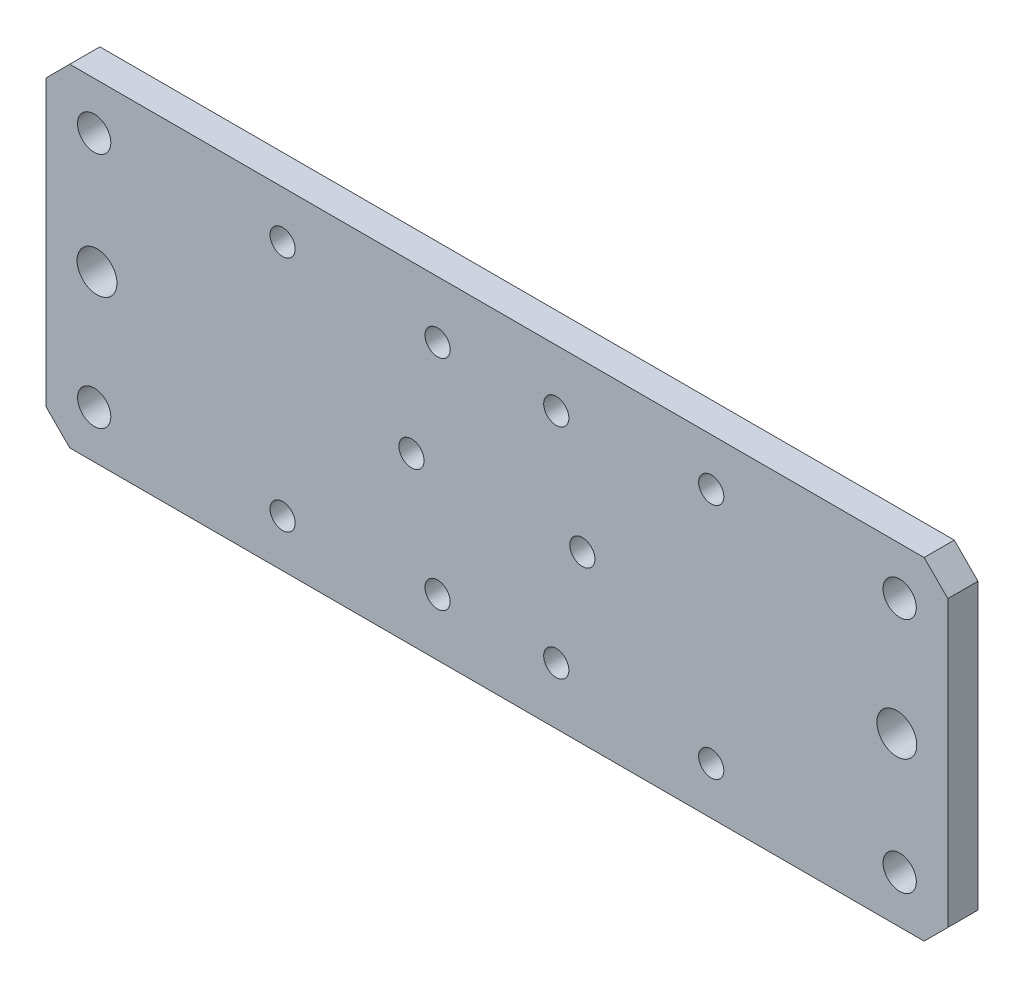
ISO-10303-21;
HEADER;
FILE_DESCRIPTION(('STEP AP214'),'2;1');
FILE_NAME('part.step','',(''),(''),'','','');
FILE_SCHEMA(('AUTOMOTIVE_DESIGN { 1 0 10303 214 1 1 1 1 }'));
ENDSEC;
DATA;
#1=APPLICATION_CONTEXT('core data for automotive mechanical design processes');
#2=APPLICATION_PROTOCOL_DEFINITION('international standard','automotive_design',2000,#1);
#3=PRODUCT_CONTEXT('',#1,'mechanical');
#4=PRODUCT('Part','Part','',(#3));
#5=PRODUCT_RELATED_PRODUCT_CATEGORY('part','',(#4));
#6=PRODUCT_DEFINITION_FORMATION('','',#4);
#7=PRODUCT_DEFINITION_CONTEXT('part definition',#1,'design');
#8=PRODUCT_DEFINITION('design','',#6,#7);
#9=PRODUCT_DEFINITION_SHAPE('','',#8);
#10=(LENGTH_UNIT() NAMED_UNIT(*) SI_UNIT(.MILLI.,.METRE.));
#11=(NAMED_UNIT(*) PLANE_ANGLE_UNIT() SI_UNIT($,.RADIAN.));
#12=(NAMED_UNIT(*) SI_UNIT($,.STERADIAN.) SOLID_ANGLE_UNIT());
#13=UNCERTAINTY_MEASURE_WITH_UNIT(LENGTH_MEASURE(1.E-05),#10,'distance_accuracy_value','');
#14=(GEOMETRIC_REPRESENTATION_CONTEXT(3) GLOBAL_UNCERTAINTY_ASSIGNED_CONTEXT((#13)) GLOBAL_UNIT_ASSIGNED_CONTEXT((#10,
#11,#12)) REPRESENTATION_CONTEXT('',''));
#15=CARTESIAN_POINT('',(0.,0.,0.));
#16=DIRECTION('',(0.,0.,1.));
#17=DIRECTION('',(1.,0.,0.));
#18=AXIS2_PLACEMENT_3D('',#15,#16,#17);
#19=CARTESIAN_POINT('',(0.,0.,17.4999999999999));
#20=DIRECTION('',(0.,0.,1.));
#21=DIRECTION('',(1.,0.,0.));
#22=AXIS2_PLACEMENT_3D('',#19,#20,#21);
#23=PLANE('',#22);
#24=CARTESIAN_POINT('',(-12.5,23.,17.4999999999999));
#25=DIRECTION('',(0.,0.,1.));
#26=DIRECTION('',(1.,0.,0.));
#27=AXIS2_PLACEMENT_3D('',#24,#25,#26);
#28=CIRCLE('',#27,2.65);
#29=CARTESIAN_POINT('',(-9.85,23.,17.4999999999999));
#30=VERTEX_POINT('',#29);
#31=EDGE_CURVE('E262',#30,#30,#28,.T.);
#32=ORIENTED_EDGE('',*,*,#31,.F.);
#33=EDGE_LOOP('',(#32));
#34=FACE_BOUND('',#33,.T.);
#35=CARTESIAN_POINT('',(12.5,23.,17.4999999999999));
#36=DIRECTION('',(0.,0.,1.));
#37=DIRECTION('',(1.,0.,0.));
#38=AXIS2_PLACEMENT_3D('',#35,#36,#37);
#39=CIRCLE('',#38,2.65);
#40=CARTESIAN_POINT('',(15.15,23.,17.4999999999999));
#41=VERTEX_POINT('',#40);
#42=EDGE_CURVE('E256',#41,#41,#39,.T.);
#43=ORIENTED_EDGE('',*,*,#42,.F.);
#44=EDGE_LOOP('',(#43));
#45=FACE_BOUND('',#44,.T.);
#46=CARTESIAN_POINT('',(18.,0.,17.4999999999999));
#47=DIRECTION('',(0.,0.,1.));
#48=DIRECTION('',(1.,0.,0.));
#49=AXIS2_PLACEMENT_3D('',#46,#47,#48);
#50=CIRCLE('',#49,2.65);
#51=CARTESIAN_POINT('',(20.65,0.,17.4999999999999));
#52=VERTEX_POINT('',#51);
#53=EDGE_CURVE('E250',#52,#52,#50,.T.);
#54=ORIENTED_EDGE('',*,*,#53,.F.);
#55=EDGE_LOOP('',(#54));
#56=FACE_BOUND('',#55,.T.);
#57=CARTESIAN_POINT('',(12.5,-23.,17.4999999999999));
#58=DIRECTION('',(0.,0.,1.));
#59=DIRECTION('',(1.,0.,0.));
#60=AXIS2_PLACEMENT_3D('',#57,#58,#59);
#61=CIRCLE('',#60,2.65);
#62=CARTESIAN_POINT('',(15.15,-23.,17.4999999999999));
#63=VERTEX_POINT('',#62);
#64=EDGE_CURVE('E244',#63,#63,#61,.T.);
#65=ORIENTED_EDGE('',*,*,#64,.F.);
#66=EDGE_LOOP('',(#65));
#67=FACE_BOUND('',#66,.T.);
#68=CARTESIAN_POINT('',(-12.5,-23.,17.4999999999999));
#69=DIRECTION('',(0.,0.,1.));
#70=DIRECTION('',(1.,0.,0.));
#71=AXIS2_PLACEMENT_3D('',#68,#69,#70);
#72=CIRCLE('',#71,2.65);
#73=CARTESIAN_POINT('',(-9.85,-23.,17.4999999999999));
#74=VERTEX_POINT('',#73);
#75=EDGE_CURVE('E238',#74,#74,#72,.T.);
#76=ORIENTED_EDGE('',*,*,#75,.F.);
#77=EDGE_LOOP('',(#76));
#78=FACE_BOUND('',#77,.T.);
#79=CARTESIAN_POINT('',(-18.,0.,17.4999999999999));
#80=DIRECTION('',(0.,0.,1.));
#81=DIRECTION('',(1.,0.,0.));
#82=AXIS2_PLACEMENT_3D('',#79,#80,#81);
#83=CIRCLE('',#82,2.65);
#84=CARTESIAN_POINT('',(-15.35,0.,17.4999999999999));
#85=VERTEX_POINT('',#84);
#86=EDGE_CURVE('E232',#85,#85,#83,.T.);
#87=ORIENTED_EDGE('',*,*,#86,.F.);
#88=EDGE_LOOP('',(#87));
#89=FACE_BOUND('',#88,.T.);
#90=CARTESIAN_POINT('',(84.8500000000001,-25.,17.4999999999999));
#91=DIRECTION('',(0.,0.,-1.));
#92=DIRECTION('',(-1.,0.,0.));
#93=AXIS2_PLACEMENT_3D('',#90,#91,#92);
#94=CIRCLE('',#93,3.5);
#95=CARTESIAN_POINT('',(81.3500000000001,-25.,17.4999999999999));
#96=VERTEX_POINT('',#95);
#97=EDGE_CURVE('E189',#96,#96,#94,.T.);
#98=ORIENTED_EDGE('',*,*,#97,.T.);
#99=EDGE_LOOP('',(#98));
#100=FACE_BOUND('',#99,.T.);
#101=CARTESIAN_POINT('',(-84.8500000000001,25.,17.4999999999999));
#102=DIRECTION('',(0.,0.,-1.));
#103=DIRECTION('',(-1.,0.,0.));
#104=AXIS2_PLACEMENT_3D('',#101,#102,#103);
#105=CIRCLE('',#104,3.5);
#106=CARTESIAN_POINT('',(-88.3500000000001,25.,17.4999999999999));
#107=VERTEX_POINT('',#106);
#108=EDGE_CURVE('E186',#107,#107,#105,.T.);
#109=ORIENTED_EDGE('',*,*,#108,.T.);
#110=EDGE_LOOP('',(#109));
#111=FACE_BOUND('',#110,.T.);
#112=CARTESIAN_POINT('',(-84.8500000000001,-25.,17.4999999999999));
#113=DIRECTION('',(0.,0.,-1.));
#114=DIRECTION('',(-1.,0.,0.));
#115=AXIS2_PLACEMENT_3D('',#112,#113,#114);
#116=CIRCLE('',#115,3.5);
#117=CARTESIAN_POINT('',(-88.3500000000001,-25.,17.4999999999999));
#118=VERTEX_POINT('',#117);
#119=EDGE_CURVE('E183',#118,#118,#116,.T.);
#120=ORIENTED_EDGE('',*,*,#119,.T.);
#121=EDGE_LOOP('',(#120));
#122=FACE_BOUND('',#121,.T.);
#123=CARTESIAN_POINT('',(84.8500000000001,25.,17.4999999999999));
#124=DIRECTION('',(0.,0.,-1.));
#125=DIRECTION('',(-1.,0.,0.));
#126=AXIS2_PLACEMENT_3D('',#123,#124,#125);
#127=CIRCLE('',#126,3.5);
#128=CARTESIAN_POINT('',(81.3500000000001,25.,17.4999999999999));
#129=VERTEX_POINT('',#128);
#130=EDGE_CURVE('E180',#129,#129,#127,.T.);
#131=ORIENTED_EDGE('',*,*,#130,.T.);
#132=EDGE_LOOP('',(#131));
#133=FACE_BOUND('',#132,.T.);
#134=CARTESIAN_POINT('',(84.25,0.,17.4999999999999));
#135=DIRECTION('',(0.,0.,-1.));
#136=DIRECTION('',(-1.,0.,0.));
#137=AXIS2_PLACEMENT_3D('',#134,#135,#136);
#138=CIRCLE('',#137,4.2);
#139=CARTESIAN_POINT('',(80.05,0.,17.4999999999999));
#140=VERTEX_POINT('',#139);
#141=EDGE_CURVE('E177',#140,#140,#138,.T.);
#142=ORIENTED_EDGE('',*,*,#141,.T.);
#143=EDGE_LOOP('',(#142));
#144=FACE_BOUND('',#143,.T.);
#145=CARTESIAN_POINT('',(-84.25,0.,17.4999999999999));
#146=DIRECTION('',(0.,0.,-1.));
#147=DIRECTION('',(-1.,0.,0.));
#148=AXIS2_PLACEMENT_3D('',#145,#146,#147);
#149=CIRCLE('',#148,4.2);
#150=CARTESIAN_POINT('',(-88.45,0.,17.4999999999999));
#151=VERTEX_POINT('',#150);
#152=EDGE_CURVE('E174',#151,#151,#149,.T.);
#153=ORIENTED_EDGE('',*,*,#152,.T.);
#154=EDGE_LOOP('',(#153));
#155=FACE_BOUND('',#154,.T.);
#156=CARTESIAN_POINT('',(45.1500000000001,-25.0000000000001,17.4999999999999));
#157=DIRECTION('',(0.,0.,-1.));
#158=DIRECTION('',(-1.,0.,0.));
#159=AXIS2_PLACEMENT_3D('',#156,#157,#158);
#160=CIRCLE('',#159,2.65);
#161=CARTESIAN_POINT('',(42.5000000000001,-25.0000000000001,17.4999999999999));
#162=VERTEX_POINT('',#161);
#163=EDGE_CURVE('E171',#162,#162,#160,.T.);
#164=ORIENTED_EDGE('',*,*,#163,.T.);
#165=EDGE_LOOP('',(#164));
#166=FACE_BOUND('',#165,.T.);
#167=CARTESIAN_POINT('',(-45.15,25.,17.4999999999999));
#168=DIRECTION('',(0.,0.,-1.));
#169=DIRECTION('',(-1.,0.,0.));
#170=AXIS2_PLACEMENT_3D('',#167,#168,#169);
#171=CIRCLE('',#170,2.65);
#172=CARTESIAN_POINT('',(-47.8,25.,17.4999999999999));
#173=VERTEX_POINT('',#172);
#174=EDGE_CURVE('E168',#173,#173,#171,.T.);
#175=ORIENTED_EDGE('',*,*,#174,.T.);
#176=EDGE_LOOP('',(#175));
#177=FACE_BOUND('',#176,.T.);
#178=CARTESIAN_POINT('',(-45.1500000000001,-25.0000000000001,17.4999999999999));
#179=DIRECTION('',(0.,0.,-1.));
#180=DIRECTION('',(-1.,0.,0.));
#181=AXIS2_PLACEMENT_3D('',#178,#179,#180);
#182=CIRCLE('',#181,2.65);
#183=CARTESIAN_POINT('',(-47.8000000000001,-25.0000000000001,17.4999999999999));
#184=VERTEX_POINT('',#183);
#185=EDGE_CURVE('E165',#184,#184,#182,.T.);
#186=ORIENTED_EDGE('',*,*,#185,.T.);
#187=EDGE_LOOP('',(#186));
#188=FACE_BOUND('',#187,.T.);
#189=CARTESIAN_POINT('',(45.15,25.,17.4999999999999));
#190=DIRECTION('',(0.,0.,-1.));
#191=DIRECTION('',(-1.,0.,0.));
#192=AXIS2_PLACEMENT_3D('',#189,#190,#191);
#193=CIRCLE('',#192,2.65);
#194=CARTESIAN_POINT('',(42.5,25.,17.4999999999999));
#195=VERTEX_POINT('',#194);
#196=EDGE_CURVE('E162',#195,#195,#193,.T.);
#197=ORIENTED_EDGE('',*,*,#196,.T.);
#198=EDGE_LOOP('',(#197));
#199=FACE_BOUND('',#198,.T.);
#200=DIRECTION('',(1.,0.,0.));
#201=VECTOR('',#200,1.);
#202=CARTESIAN_POINT('',(95.,34.9999999999998,17.4999999999999));
#203=LINE('',#202,#201);
#204=CARTESIAN_POINT('',(-90.,34.9999999999998,17.4999999999999));
#205=VERTEX_POINT('',#204);
#206=CARTESIAN_POINT('',(90.,34.9999999999998,17.4999999999999));
#207=VERTEX_POINT('',#206);
#208=EDGE_CURVE('E144',#205,#207,#203,.T.);
#209=ORIENTED_EDGE('',*,*,#208,.F.);
#210=DIRECTION('',(0.70710678118655,0.707106781186545,0.));
#211=VECTOR('',#210,1.);
#212=CARTESIAN_POINT('',(-62.4999999999996,62.5,17.4999999999999));
#213=LINE('',#212,#211);
#214=CARTESIAN_POINT('',(-95.,29.9999999999998,17.4999999999999));
#215=VERTEX_POINT('',#214);
#216=EDGE_CURVE('E114',#205,#215,#213,.F.);
#217=ORIENTED_EDGE('',*,*,#216,.T.);
#218=DIRECTION('',(0.,-1.,0.));
#219=VECTOR('',#218,1.);
#220=CARTESIAN_POINT('',(-95.,34.9999999999998,17.4999999999999));
#221=LINE('',#220,#219);
#222=CARTESIAN_POINT('',(-94.9999999999999,-29.9999999999997,17.4999999999999));
#223=VERTEX_POINT('',#222);
#224=EDGE_CURVE('E104',#223,#215,#221,.F.);
#225=ORIENTED_EDGE('',*,*,#224,.F.);
#226=DIRECTION('',(-0.707106781186546,0.707106781186549,0.));
#227=VECTOR('',#226,1.);
#228=CARTESIAN_POINT('',(-62.5000000000001,-62.4999999999998,17.4999999999999));
#229=LINE('',#228,#227);
#230=CARTESIAN_POINT('',(-89.9999999999999,-34.9999999999998,17.4999999999999));
#231=VERTEX_POINT('',#230);
#232=EDGE_CURVE('E48',#223,#231,#229,.F.);
#233=ORIENTED_EDGE('',*,*,#232,.T.);
#234=DIRECTION('',(1.,0.,0.));
#235=VECTOR('',#234,1.);
#236=CARTESIAN_POINT('',(-94.9999999999999,-34.9999999999998,17.4999999999999));
#237=LINE('',#236,#235);
#238=CARTESIAN_POINT('',(90.,-34.9999999999999,17.4999999999999));
#239=VERTEX_POINT('',#238);
#240=EDGE_CURVE('E115',#239,#231,#237,.F.);
#241=ORIENTED_EDGE('',*,*,#240,.F.);
#242=DIRECTION('',(-0.707106781186548,-0.707106781186547,0.));
#243=VECTOR('',#242,1.);
#244=CARTESIAN_POINT('',(62.4999999999998,-62.4999999999999,17.4999999999999));
#245=LINE('',#244,#243);
#246=CARTESIAN_POINT('',(95.,-29.9999999999999,17.4999999999999));
#247=VERTEX_POINT('',#246);
#248=EDGE_CURVE('E122',#239,#247,#245,.F.);
#249=ORIENTED_EDGE('',*,*,#248,.T.);
#250=DIRECTION('',(0.,1.,0.));
#251=VECTOR('',#250,1.);
#252=CARTESIAN_POINT('',(95.,-34.9999999999998,17.4999999999999));
#253=LINE('',#252,#251);
#254=CARTESIAN_POINT('',(95.,29.9999999999998,17.4999999999999));
#255=VERTEX_POINT('',#254);
#256=EDGE_CURVE('E136',#255,#247,#253,.F.);
#257=ORIENTED_EDGE('',*,*,#256,.F.);
#258=DIRECTION('',(0.707106781186546,-0.707106781186549,0.));
#259=VECTOR('',#258,1.);
#260=CARTESIAN_POINT('',(62.5000000000002,62.4999999999998,17.4999999999999));
#261=LINE('',#260,#259);
#262=EDGE_CURVE('E125',#255,#207,#261,.F.);
#263=ORIENTED_EDGE('',*,*,#262,.T.);
#264=EDGE_LOOP('',(#209,#217,#225,#233,#241,#249,#257,#263));
#265=FACE_BOUND('',#264,.T.);
#266=ADVANCED_FACE('F33',(#34,#45,#56,#67,#78,#89,#100,#111,#122,#133,#144,#155,#166,#177,#188,
#199,#265),#23,.T.);
#267=CARTESIAN_POINT('',(-95.,34.9999999999998,11.1499999999999));
#268=DIRECTION('',(-1.,0.,0.));
#269=DIRECTION('',(0.,-1.,0.));
#270=AXIS2_PLACEMENT_3D('',#267,#268,#269);
#271=PLANE('',#270);
#272=ORIENTED_EDGE('',*,*,#224,.T.);
#273=DIRECTION('',(0.,0.,-1.));
#274=VECTOR('',#273,1.);
#275=CARTESIAN_POINT('',(-95.,29.9999999999998,11.1499999999999));
#276=LINE('',#275,#274);
#277=CARTESIAN_POINT('',(-95.,29.9999999999998,11.1499999999999));
#278=VERTEX_POINT('',#277);
#279=EDGE_CURVE('E109',#215,#278,#276,.T.);
#280=ORIENTED_EDGE('',*,*,#279,.T.);
#281=DIRECTION('',(0.,1.,0.));
#282=VECTOR('',#281,1.);
#283=CARTESIAN_POINT('',(-95.,0.,11.1499999999999));
#284=LINE('',#283,#282);
#285=CARTESIAN_POINT('',(-95.,-29.9999999999997,11.1499999999999));
#286=VERTEX_POINT('',#285);
#287=EDGE_CURVE('E107',#278,#286,#284,.F.);
#288=ORIENTED_EDGE('',*,*,#287,.T.);
#289=DIRECTION('',(0.,0.,1.));
#290=VECTOR('',#289,1.);
#291=CARTESIAN_POINT('',(-94.9999999999999,-29.9999999999997,11.1499999999999));
#292=LINE('',#291,#290);
#293=EDGE_CURVE('E101',#286,#223,#292,.T.);
#294=ORIENTED_EDGE('',*,*,#293,.T.);
#295=EDGE_LOOP('',(#272,#280,#288,#294));
#296=FACE_BOUND('',#295,.T.);
#297=ADVANCED_FACE('F102',(#296),#271,.T.);
#298=CARTESIAN_POINT('',(-94.9999999999999,-34.9999999999998,11.1499999999999));
#299=DIRECTION('',(0.,-1.,0.));
#300=DIRECTION('',(1.,0.,0.));
#301=AXIS2_PLACEMENT_3D('',#298,#299,#300);
#302=PLANE('',#301);
#303=ORIENTED_EDGE('',*,*,#240,.T.);
#304=DIRECTION('',(0.,0.,-1.));
#305=VECTOR('',#304,1.);
#306=CARTESIAN_POINT('',(-89.9999999999999,-34.9999999999998,11.1499999999999));
#307=LINE('',#306,#305);
#308=CARTESIAN_POINT('',(-89.9999999999999,-34.9999999999998,11.1499999999999));
#309=VERTEX_POINT('',#308);
#310=EDGE_CURVE('E121',#231,#309,#307,.T.);
#311=ORIENTED_EDGE('',*,*,#310,.T.);
#312=DIRECTION('',(1.,0.,0.));
#313=VECTOR('',#312,1.);
#314=CARTESIAN_POINT('',(0.,-34.9999999999998,11.1499999999999));
#315=LINE('',#314,#313);
#316=CARTESIAN_POINT('',(90.,-34.9999999999998,11.1499999999999));
#317=VERTEX_POINT('',#316);
#318=EDGE_CURVE('E225',#309,#317,#315,.T.);
#319=ORIENTED_EDGE('',*,*,#318,.T.);
#320=DIRECTION('',(0.,0.,1.));
#321=VECTOR('',#320,1.);
#322=CARTESIAN_POINT('',(90.,-34.9999999999999,11.1499999999999));
#323=LINE('',#322,#321);
#324=EDGE_CURVE('E55',#317,#239,#323,.T.);
#325=ORIENTED_EDGE('',*,*,#324,.T.);
#326=EDGE_LOOP('',(#303,#311,#319,#325));
#327=FACE_BOUND('',#326,.T.);
#328=ADVANCED_FACE('F377',(#327),#302,.T.);
#329=CARTESIAN_POINT('',(95.,-34.9999999999998,11.1499999999999));
#330=DIRECTION('',(1.,0.,0.));
#331=DIRECTION('',(0.,1.,0.));
#332=AXIS2_PLACEMENT_3D('',#329,#330,#331);
#333=PLANE('',#332);
#334=ORIENTED_EDGE('',*,*,#256,.T.);
#335=DIRECTION('',(0.,0.,-1.));
#336=VECTOR('',#335,1.);
#337=CARTESIAN_POINT('',(95.,-29.9999999999999,11.1499999999999));
#338=LINE('',#337,#336);
#339=CARTESIAN_POINT('',(95.,-29.9999999999999,11.1499999999999));
#340=VERTEX_POINT('',#339);
#341=EDGE_CURVE('E11',#247,#340,#338,.T.);
#342=ORIENTED_EDGE('',*,*,#341,.T.);
#343=DIRECTION('',(0.,1.,0.));
#344=VECTOR('',#343,1.);
#345=CARTESIAN_POINT('',(95.,0.,11.1499999999999));
#346=LINE('',#345,#344);
#347=CARTESIAN_POINT('',(95.,29.9999999999998,11.1499999999999));
#348=VERTEX_POINT('',#347);
#349=EDGE_CURVE('E139',#340,#348,#346,.T.);
#350=ORIENTED_EDGE('',*,*,#349,.T.);
#351=DIRECTION('',(0.,0.,1.));
#352=VECTOR('',#351,1.);
#353=CARTESIAN_POINT('',(95.,29.9999999999998,11.1499999999999));
#354=LINE('',#353,#352);
#355=EDGE_CURVE('E41',#348,#255,#354,.T.);
#356=ORIENTED_EDGE('',*,*,#355,.T.);
#357=EDGE_LOOP('',(#334,#342,#350,#356));
#358=FACE_BOUND('',#357,.T.);
#359=ADVANCED_FACE('F135',(#358),#333,.T.);
#360=CARTESIAN_POINT('',(95.,34.9999999999998,11.1499999999999));
#361=DIRECTION('',(0.,1.,0.));
#362=DIRECTION('',(0.,0.,1.));
#363=AXIS2_PLACEMENT_3D('',#360,#361,#362);
#364=PLANE('',#363);
#365=DIRECTION('',(1.,0.,0.));
#366=VECTOR('',#365,1.);
#367=CARTESIAN_POINT('',(0.,34.9999999999998,11.1499999999999));
#368=LINE('',#367,#366);
#369=CARTESIAN_POINT('',(90.,34.9999999999998,11.1499999999999));
#370=VERTEX_POINT('',#369);
#371=CARTESIAN_POINT('',(-90.,34.9999999999998,11.1499999999999));
#372=VERTEX_POINT('',#371);
#373=EDGE_CURVE('E196',#370,#372,#368,.F.);
#374=ORIENTED_EDGE('',*,*,#373,.T.);
#375=DIRECTION('',(0.,0.,1.));
#376=VECTOR('',#375,1.);
#377=CARTESIAN_POINT('',(-90.,34.9999999999998,11.1499999999999));
#378=LINE('',#377,#376);
#379=EDGE_CURVE('E149',#372,#205,#378,.T.);
#380=ORIENTED_EDGE('',*,*,#379,.T.);
#381=ORIENTED_EDGE('',*,*,#208,.T.);
#382=DIRECTION('',(0.,0.,-1.));
#383=VECTOR('',#382,1.);
#384=CARTESIAN_POINT('',(90.,34.9999999999998,11.1499999999999));
#385=LINE('',#384,#383);
#386=EDGE_CURVE('E148',#207,#370,#385,.T.);
#387=ORIENTED_EDGE('',*,*,#386,.T.);
#388=EDGE_LOOP('',(#374,#380,#381,#387));
#389=FACE_BOUND('',#388,.T.);
#390=ADVANCED_FACE('F305',(#389),#364,.T.);
#391=CARTESIAN_POINT('',(45.15,25.,14.0074999999999));
#392=DIRECTION('',(0.,0.,-1.));
#393=DIRECTION('',(-1.,0.,0.));
#394=AXIS2_PLACEMENT_3D('',#391,#392,#393);
#395=CYLINDRICAL_SURFACE('',#394,2.65);
#396=CARTESIAN_POINT('',(45.15,25.,11.1499999999999));
#397=DIRECTION('',(0.,0.,-1.));
#398=DIRECTION('',(-1.,0.,0.));
#399=AXIS2_PLACEMENT_3D('',#396,#397,#398);
#400=CIRCLE('',#399,2.65);
#401=CARTESIAN_POINT('',(42.5,25.,11.1499999999999));
#402=VERTEX_POINT('',#401);
#403=EDGE_CURVE('E192',#402,#402,#400,.T.);
#404=ORIENTED_EDGE('',*,*,#403,.T.);
#405=EDGE_LOOP('',(#404));
#406=FACE_BOUND('',#405,.T.);
#407=ORIENTED_EDGE('',*,*,#196,.F.);
#408=EDGE_LOOP('',(#407));
#409=FACE_BOUND('',#408,.T.);
#410=ADVANCED_FACE('F302',(#406,#409),#395,.F.);
#411=CARTESIAN_POINT('',(-45.1500000000001,-25.0000000000001,14.0074999999999));
#412=DIRECTION('',(0.,0.,-1.));
#413=DIRECTION('',(-1.,0.,0.));
#414=AXIS2_PLACEMENT_3D('',#411,#412,#413);
#415=CYLINDRICAL_SURFACE('',#414,2.65);
#416=CARTESIAN_POINT('',(-45.1500000000001,-25.0000000000001,11.1499999999999));
#417=DIRECTION('',(0.,0.,-1.));
#418=DIRECTION('',(-1.,0.,0.));
#419=AXIS2_PLACEMENT_3D('',#416,#417,#418);
#420=CIRCLE('',#419,2.65);
#421=CARTESIAN_POINT('',(-47.8000000000001,-25.0000000000001,11.1499999999999));
#422=VERTEX_POINT('',#421);
#423=EDGE_CURVE('E195',#422,#422,#420,.T.);
#424=ORIENTED_EDGE('',*,*,#423,.T.);
#425=EDGE_LOOP('',(#424));
#426=FACE_BOUND('',#425,.T.);
#427=ORIENTED_EDGE('',*,*,#185,.F.);
#428=EDGE_LOOP('',(#427));
#429=FACE_BOUND('',#428,.T.);
#430=ADVANCED_FACE('F304',(#426,#429),#415,.F.);
#431=CARTESIAN_POINT('',(-45.15,25.,14.0074999999999));
#432=DIRECTION('',(0.,0.,-1.));
#433=DIRECTION('',(-1.,0.,0.));
#434=AXIS2_PLACEMENT_3D('',#431,#432,#433);
#435=CYLINDRICAL_SURFACE('',#434,2.65);
#436=CARTESIAN_POINT('',(-45.15,25.,11.1499999999999));
#437=DIRECTION('',(0.,0.,-1.));
#438=DIRECTION('',(-1.,0.,0.));
#439=AXIS2_PLACEMENT_3D('',#436,#437,#438);
#440=CIRCLE('',#439,2.65);
#441=CARTESIAN_POINT('',(-47.8,25.,11.1499999999999));
#442=VERTEX_POINT('',#441);
#443=EDGE_CURVE('E199',#442,#442,#440,.T.);
#444=ORIENTED_EDGE('',*,*,#443,.T.);
#445=EDGE_LOOP('',(#444));
#446=FACE_BOUND('',#445,.T.);
#447=ORIENTED_EDGE('',*,*,#174,.F.);
#448=EDGE_LOOP('',(#447));
#449=FACE_BOUND('',#448,.T.);
#450=ADVANCED_FACE('F313',(#446,#449),#435,.F.);
#451=CARTESIAN_POINT('',(45.1500000000001,-25.0000000000001,14.0074999999999));
#452=DIRECTION('',(0.,0.,-1.));
#453=DIRECTION('',(-1.,0.,0.));
#454=AXIS2_PLACEMENT_3D('',#451,#452,#453);
#455=CYLINDRICAL_SURFACE('',#454,2.65);
#456=CARTESIAN_POINT('',(45.1500000000001,-25.0000000000001,11.1499999999999));
#457=DIRECTION('',(0.,0.,-1.));
#458=DIRECTION('',(-1.,0.,0.));
#459=AXIS2_PLACEMENT_3D('',#456,#457,#458);
#460=CIRCLE('',#459,2.65);
#461=CARTESIAN_POINT('',(42.5000000000001,-25.0000000000001,11.1499999999999));
#462=VERTEX_POINT('',#461);
#463=EDGE_CURVE('E202',#462,#462,#460,.T.);
#464=ORIENTED_EDGE('',*,*,#463,.T.);
#465=EDGE_LOOP('',(#464));
#466=FACE_BOUND('',#465,.T.);
#467=ORIENTED_EDGE('',*,*,#163,.F.);
#468=EDGE_LOOP('',(#467));
#469=FACE_BOUND('',#468,.T.);
#470=ADVANCED_FACE('F357',(#466,#469),#455,.F.);
#471=CARTESIAN_POINT('',(-84.25,0.,14.3249999999999));
#472=DIRECTION('',(0.,0.,-1.));
#473=DIRECTION('',(-1.,0.,0.));
#474=AXIS2_PLACEMENT_3D('',#471,#472,#473);
#475=CYLINDRICAL_SURFACE('',#474,4.2);
#476=CARTESIAN_POINT('',(-84.25,0.,11.1499999999999));
#477=DIRECTION('',(0.,0.,-1.));
#478=DIRECTION('',(-1.,0.,0.));
#479=AXIS2_PLACEMENT_3D('',#476,#477,#478);
#480=CIRCLE('',#479,4.2);
#481=CARTESIAN_POINT('',(-88.45,0.,11.1499999999999));
#482=VERTEX_POINT('',#481);
#483=EDGE_CURVE('E205',#482,#482,#480,.T.);
#484=ORIENTED_EDGE('',*,*,#483,.T.);
#485=EDGE_LOOP('',(#484));
#486=FACE_BOUND('',#485,.T.);
#487=ORIENTED_EDGE('',*,*,#152,.F.);
#488=EDGE_LOOP('',(#487));
#489=FACE_BOUND('',#488,.T.);
#490=ADVANCED_FACE('F353',(#486,#489),#475,.F.);
#491=CARTESIAN_POINT('',(84.25,0.,14.3249999999999));
#492=DIRECTION('',(0.,0.,-1.));
#493=DIRECTION('',(-1.,0.,0.));
#494=AXIS2_PLACEMENT_3D('',#491,#492,#493);
#495=CYLINDRICAL_SURFACE('',#494,4.2);
#496=CARTESIAN_POINT('',(84.25,0.,11.1499999999999));
#497=DIRECTION('',(0.,0.,-1.));
#498=DIRECTION('',(-1.,0.,0.));
#499=AXIS2_PLACEMENT_3D('',#496,#497,#498);
#500=CIRCLE('',#499,4.2);
#501=CARTESIAN_POINT('',(80.05,0.,11.1499999999999));
#502=VERTEX_POINT('',#501);
#503=EDGE_CURVE('E208',#502,#502,#500,.T.);
#504=ORIENTED_EDGE('',*,*,#503,.T.);
#505=EDGE_LOOP('',(#504));
#506=FACE_BOUND('',#505,.T.);
#507=ORIENTED_EDGE('',*,*,#141,.F.);
#508=EDGE_LOOP('',(#507));
#509=FACE_BOUND('',#508,.T.);
#510=ADVANCED_FACE('F349',(#506,#509),#495,.F.);
#511=CARTESIAN_POINT('',(84.8500000000001,25.,14.0074999999999));
#512=DIRECTION('',(0.,0.,-1.));
#513=DIRECTION('',(-1.,0.,0.));
#514=AXIS2_PLACEMENT_3D('',#511,#512,#513);
#515=CYLINDRICAL_SURFACE('',#514,3.5);
#516=CARTESIAN_POINT('',(84.8500000000001,25.,11.1499999999999));
#517=DIRECTION('',(0.,0.,-1.));
#518=DIRECTION('',(-1.,0.,0.));
#519=AXIS2_PLACEMENT_3D('',#516,#517,#518);
#520=CIRCLE('',#519,3.5);
#521=CARTESIAN_POINT('',(81.3500000000001,25.,11.1499999999999));
#522=VERTEX_POINT('',#521);
#523=EDGE_CURVE('E211',#522,#522,#520,.T.);
#524=ORIENTED_EDGE('',*,*,#523,.T.);
#525=EDGE_LOOP('',(#524));
#526=FACE_BOUND('',#525,.T.);
#527=ORIENTED_EDGE('',*,*,#130,.F.);
#528=EDGE_LOOP('',(#527));
#529=FACE_BOUND('',#528,.T.);
#530=ADVANCED_FACE('F345',(#526,#529),#515,.F.);
#531=CARTESIAN_POINT('',(-84.8500000000001,-25.,14.0074999999999));
#532=DIRECTION('',(0.,0.,-1.));
#533=DIRECTION('',(-1.,0.,0.));
#534=AXIS2_PLACEMENT_3D('',#531,#532,#533);
#535=CYLINDRICAL_SURFACE('',#534,3.5);
#536=CARTESIAN_POINT('',(-84.8500000000001,-25.,11.1499999999999));
#537=DIRECTION('',(0.,0.,-1.));
#538=DIRECTION('',(-1.,0.,0.));
#539=AXIS2_PLACEMENT_3D('',#536,#537,#538);
#540=CIRCLE('',#539,3.5);
#541=CARTESIAN_POINT('',(-88.3500000000001,-25.,11.1499999999999));
#542=VERTEX_POINT('',#541);
#543=EDGE_CURVE('E214',#542,#542,#540,.T.);
#544=ORIENTED_EDGE('',*,*,#543,.T.);
#545=EDGE_LOOP('',(#544));
#546=FACE_BOUND('',#545,.T.);
#547=ORIENTED_EDGE('',*,*,#119,.F.);
#548=EDGE_LOOP('',(#547));
#549=FACE_BOUND('',#548,.T.);
#550=ADVANCED_FACE('F341',(#546,#549),#535,.F.);
#551=CARTESIAN_POINT('',(-84.8500000000001,25.,14.0074999999999));
#552=DIRECTION('',(0.,0.,-1.));
#553=DIRECTION('',(-1.,0.,0.));
#554=AXIS2_PLACEMENT_3D('',#551,#552,#553);
#555=CYLINDRICAL_SURFACE('',#554,3.5);
#556=CARTESIAN_POINT('',(-84.8500000000001,25.,11.1499999999999));
#557=DIRECTION('',(0.,0.,-1.));
#558=DIRECTION('',(-1.,0.,0.));
#559=AXIS2_PLACEMENT_3D('',#556,#557,#558);
#560=CIRCLE('',#559,3.5);
#561=CARTESIAN_POINT('',(-88.3500000000001,25.,11.1499999999999));
#562=VERTEX_POINT('',#561);
#563=EDGE_CURVE('E217',#562,#562,#560,.T.);
#564=ORIENTED_EDGE('',*,*,#563,.T.);
#565=EDGE_LOOP('',(#564));
#566=FACE_BOUND('',#565,.T.);
#567=ORIENTED_EDGE('',*,*,#108,.F.);
#568=EDGE_LOOP('',(#567));
#569=FACE_BOUND('',#568,.T.);
#570=ADVANCED_FACE('F331',(#566,#569),#555,.F.);
#571=CARTESIAN_POINT('',(84.8500000000001,-25.,14.0074999999999));
#572=DIRECTION('',(0.,0.,-1.));
#573=DIRECTION('',(-1.,0.,0.));
#574=AXIS2_PLACEMENT_3D('',#571,#572,#573);
#575=CYLINDRICAL_SURFACE('',#574,3.5);
#576=CARTESIAN_POINT('',(84.8500000000001,-25.,11.1499999999999));
#577=DIRECTION('',(0.,0.,-1.));
#578=DIRECTION('',(-1.,0.,0.));
#579=AXIS2_PLACEMENT_3D('',#576,#577,#578);
#580=CIRCLE('',#579,3.5);
#581=CARTESIAN_POINT('',(81.3500000000001,-25.,11.1499999999999));
#582=VERTEX_POINT('',#581);
#583=EDGE_CURVE('E110',#582,#582,#580,.T.);
#584=ORIENTED_EDGE('',*,*,#583,.T.);
#585=EDGE_LOOP('',(#584));
#586=FACE_BOUND('',#585,.T.);
#587=ORIENTED_EDGE('',*,*,#97,.F.);
#588=EDGE_LOOP('',(#587));
#589=FACE_BOUND('',#588,.T.);
#590=ADVANCED_FACE('F321',(#586,#589),#575,.F.);
#591=CARTESIAN_POINT('',(0.,0.,11.1499999999999));
#592=DIRECTION('',(0.,0.,1.));
#593=DIRECTION('',(1.,0.,0.));
#594=AXIS2_PLACEMENT_3D('',#591,#592,#593);
#595=PLANE('',#594);
#596=CARTESIAN_POINT('',(-12.5,23.,11.1499999999999));
#597=DIRECTION('',(0.,0.,1.));
#598=DIRECTION('',(1.,0.,0.));
#599=AXIS2_PLACEMENT_3D('',#596,#597,#598);
#600=CIRCLE('',#599,2.65);
#601=CARTESIAN_POINT('',(-9.85,23.,11.1499999999999));
#602=VERTEX_POINT('',#601);
#603=EDGE_CURVE('E259',#602,#602,#600,.T.);
#604=ORIENTED_EDGE('',*,*,#603,.T.);
#605=EDGE_LOOP('',(#604));
#606=FACE_BOUND('',#605,.T.);
#607=CARTESIAN_POINT('',(12.5,23.,11.1499999999999));
#608=DIRECTION('',(0.,0.,1.));
#609=DIRECTION('',(1.,0.,0.));
#610=AXIS2_PLACEMENT_3D('',#607,#608,#609);
#611=CIRCLE('',#610,2.65);
#612=CARTESIAN_POINT('',(15.15,23.,11.1499999999999));
#613=VERTEX_POINT('',#612);
#614=EDGE_CURVE('E253',#613,#613,#611,.T.);
#615=ORIENTED_EDGE('',*,*,#614,.T.);
#616=EDGE_LOOP('',(#615));
#617=FACE_BOUND('',#616,.T.);
#618=CARTESIAN_POINT('',(18.,0.,11.1499999999999));
#619=DIRECTION('',(0.,0.,1.));
#620=DIRECTION('',(1.,0.,0.));
#621=AXIS2_PLACEMENT_3D('',#618,#619,#620);
#622=CIRCLE('',#621,2.65);
#623=CARTESIAN_POINT('',(20.65,0.,11.1499999999999));
#624=VERTEX_POINT('',#623);
#625=EDGE_CURVE('E247',#624,#624,#622,.T.);
#626=ORIENTED_EDGE('',*,*,#625,.T.);
#627=EDGE_LOOP('',(#626));
#628=FACE_BOUND('',#627,.T.);
#629=CARTESIAN_POINT('',(12.5,-23.,11.1499999999999));
#630=DIRECTION('',(0.,0.,1.));
#631=DIRECTION('',(1.,0.,0.));
#632=AXIS2_PLACEMENT_3D('',#629,#630,#631);
#633=CIRCLE('',#632,2.65);
#634=CARTESIAN_POINT('',(15.15,-23.,11.1499999999999));
#635=VERTEX_POINT('',#634);
#636=EDGE_CURVE('E241',#635,#635,#633,.T.);
#637=ORIENTED_EDGE('',*,*,#636,.T.);
#638=EDGE_LOOP('',(#637));
#639=FACE_BOUND('',#638,.T.);
#640=CARTESIAN_POINT('',(-12.5,-23.,11.1499999999999));
#641=DIRECTION('',(0.,0.,1.));
#642=DIRECTION('',(1.,0.,0.));
#643=AXIS2_PLACEMENT_3D('',#640,#641,#642);
#644=CIRCLE('',#643,2.65);
#645=CARTESIAN_POINT('',(-9.85,-23.,11.1499999999999));
#646=VERTEX_POINT('',#645);
#647=EDGE_CURVE('E235',#646,#646,#644,.T.);
#648=ORIENTED_EDGE('',*,*,#647,.T.);
#649=EDGE_LOOP('',(#648));
#650=FACE_BOUND('',#649,.T.);
#651=CARTESIAN_POINT('',(-18.,0.,11.1499999999999));
#652=DIRECTION('',(0.,0.,1.));
#653=DIRECTION('',(1.,0.,0.));
#654=AXIS2_PLACEMENT_3D('',#651,#652,#653);
#655=CIRCLE('',#654,2.65);
#656=CARTESIAN_POINT('',(-15.35,0.,11.1499999999999));
#657=VERTEX_POINT('',#656);
#658=EDGE_CURVE('E116',#657,#657,#655,.T.);
#659=ORIENTED_EDGE('',*,*,#658,.T.);
#660=EDGE_LOOP('',(#659));
#661=FACE_BOUND('',#660,.T.);
#662=ORIENTED_EDGE('',*,*,#583,.F.);
#663=EDGE_LOOP('',(#662));
#664=FACE_BOUND('',#663,.T.);
#665=ORIENTED_EDGE('',*,*,#563,.F.);
#666=EDGE_LOOP('',(#665));
#667=FACE_BOUND('',#666,.T.);
#668=ORIENTED_EDGE('',*,*,#543,.F.);
#669=EDGE_LOOP('',(#668));
#670=FACE_BOUND('',#669,.T.);
#671=ORIENTED_EDGE('',*,*,#523,.F.);
#672=EDGE_LOOP('',(#671));
#673=FACE_BOUND('',#672,.T.);
#674=ORIENTED_EDGE('',*,*,#503,.F.);
#675=EDGE_LOOP('',(#674));
#676=FACE_BOUND('',#675,.T.);
#677=ORIENTED_EDGE('',*,*,#483,.F.);
#678=EDGE_LOOP('',(#677));
#679=FACE_BOUND('',#678,.T.);
#680=ORIENTED_EDGE('',*,*,#463,.F.);
#681=EDGE_LOOP('',(#680));
#682=FACE_BOUND('',#681,.T.);
#683=ORIENTED_EDGE('',*,*,#443,.F.);
#684=EDGE_LOOP('',(#683));
#685=FACE_BOUND('',#684,.T.);
#686=ORIENTED_EDGE('',*,*,#423,.F.);
#687=EDGE_LOOP('',(#686));
#688=FACE_BOUND('',#687,.T.);
#689=ORIENTED_EDGE('',*,*,#403,.F.);
#690=EDGE_LOOP('',(#689));
#691=FACE_BOUND('',#690,.T.);
#692=ORIENTED_EDGE('',*,*,#287,.F.);
#693=DIRECTION('',(-0.70710678118655,-0.707106781186545,0.));
#694=VECTOR('',#693,1.);
#695=CARTESIAN_POINT('',(-95.,29.9999999999998,11.1499999999999));
#696=LINE('',#695,#694);
#697=EDGE_CURVE('E153',#278,#372,#696,.F.);
#698=ORIENTED_EDGE('',*,*,#697,.T.);
#699=ORIENTED_EDGE('',*,*,#373,.F.);
#700=DIRECTION('',(-0.707106781186546,0.707106781186549,0.));
#701=VECTOR('',#700,1.);
#702=CARTESIAN_POINT('',(90.,34.9999999999998,11.1499999999999));
#703=LINE('',#702,#701);
#704=EDGE_CURVE('E159',#370,#348,#703,.F.);
#705=ORIENTED_EDGE('',*,*,#704,.T.);
#706=ORIENTED_EDGE('',*,*,#349,.F.);
#707=DIRECTION('',(0.707106781186548,0.707106781186547,0.));
#708=VECTOR('',#707,1.);
#709=CARTESIAN_POINT('',(95.,-29.9999999999999,11.1499999999999));
#710=LINE('',#709,#708);
#711=EDGE_CURVE('E157',#340,#317,#710,.F.);
#712=ORIENTED_EDGE('',*,*,#711,.T.);
#713=ORIENTED_EDGE('',*,*,#318,.F.);
#714=DIRECTION('',(0.707106781186546,-0.707106781186549,0.));
#715=VECTOR('',#714,1.);
#716=CARTESIAN_POINT('',(-89.9999999999999,-34.9999999999998,11.1499999999999));
#717=LINE('',#716,#715);
#718=EDGE_CURVE('E155',#309,#286,#717,.F.);
#719=ORIENTED_EDGE('',*,*,#718,.T.);
#720=EDGE_LOOP('',(#692,#698,#699,#705,#706,#712,#713,#719));
#721=FACE_BOUND('',#720,.T.);
#722=ADVANCED_FACE('F319',(#606,#617,#628,#639,#650,#661,#664,#667,#670,#673,#676,#679,#682,
#685,#688,#691,#721),#595,.F.);
#723=CARTESIAN_POINT('',(-95.,29.9999999999998,11.1499999999999));
#724=DIRECTION('',(0.707106781186545,-0.70710678118655,0.));
#725=DIRECTION('',(0.,0.,-1.));
#726=AXIS2_PLACEMENT_3D('',#723,#724,#725);
#727=PLANE('',#726);
#728=ORIENTED_EDGE('',*,*,#216,.F.);
#729=ORIENTED_EDGE('',*,*,#379,.F.);
#730=ORIENTED_EDGE('',*,*,#697,.F.);
#731=ORIENTED_EDGE('',*,*,#279,.F.);
#732=EDGE_LOOP('',(#728,#729,#730,#731));
#733=FACE_BOUND('',#732,.T.);
#734=ADVANCED_FACE('F271',(#733),#727,.F.);
#735=CARTESIAN_POINT('',(-89.9999999999999,-34.9999999999998,11.1499999999999));
#736=DIRECTION('',(0.707106781186549,0.707106781186546,0.));
#737=DIRECTION('',(0.,0.,-1.));
#738=AXIS2_PLACEMENT_3D('',#735,#736,#737);
#739=PLANE('',#738);
#740=ORIENTED_EDGE('',*,*,#232,.F.);
#741=ORIENTED_EDGE('',*,*,#293,.F.);
#742=ORIENTED_EDGE('',*,*,#718,.F.);
#743=ORIENTED_EDGE('',*,*,#310,.F.);
#744=EDGE_LOOP('',(#740,#741,#742,#743));
#745=FACE_BOUND('',#744,.T.);
#746=ADVANCED_FACE('F119',(#745),#739,.F.);
#747=CARTESIAN_POINT('',(95.,-29.9999999999999,11.1499999999999));
#748=DIRECTION('',(-0.707106781186547,0.707106781186548,0.));
#749=DIRECTION('',(0.,0.,-1.));
#750=AXIS2_PLACEMENT_3D('',#747,#748,#749);
#751=PLANE('',#750);
#752=ORIENTED_EDGE('',*,*,#248,.F.);
#753=ORIENTED_EDGE('',*,*,#324,.F.);
#754=ORIENTED_EDGE('',*,*,#711,.F.);
#755=ORIENTED_EDGE('',*,*,#341,.F.);
#756=EDGE_LOOP('',(#752,#753,#754,#755));
#757=FACE_BOUND('',#756,.T.);
#758=ADVANCED_FACE('F379',(#757),#751,.F.);
#759=CARTESIAN_POINT('',(90.,34.9999999999998,11.1499999999999));
#760=DIRECTION('',(-0.707106781186549,-0.707106781186545,0.));
#761=DIRECTION('',(0.,0.,-1.));
#762=AXIS2_PLACEMENT_3D('',#759,#760,#761);
#763=PLANE('',#762);
#764=ORIENTED_EDGE('',*,*,#262,.F.);
#765=ORIENTED_EDGE('',*,*,#355,.F.);
#766=ORIENTED_EDGE('',*,*,#704,.F.);
#767=ORIENTED_EDGE('',*,*,#386,.F.);
#768=EDGE_LOOP('',(#764,#765,#766,#767));
#769=FACE_BOUND('',#768,.T.);
#770=ADVANCED_FACE('F35',(#769),#763,.F.);
#771=CARTESIAN_POINT('',(-18.,0.,17.4999999999999));
#772=DIRECTION('',(0.,0.,1.));
#773=DIRECTION('',(1.,0.,0.));
#774=AXIS2_PLACEMENT_3D('',#771,#772,#773);
#775=CYLINDRICAL_SURFACE('',#774,2.65);
#776=ORIENTED_EDGE('',*,*,#658,.F.);
#777=EDGE_LOOP('',(#776));
#778=FACE_BOUND('',#777,.T.);
#779=ORIENTED_EDGE('',*,*,#86,.T.);
#780=EDGE_LOOP('',(#779));
#781=FACE_BOUND('',#780,.T.);
#782=ADVANCED_FACE('F336',(#778,#781),#775,.F.);
#783=CARTESIAN_POINT('',(-12.5,-23.,17.4999999999999));
#784=DIRECTION('',(0.,0.,1.));
#785=DIRECTION('',(1.,0.,0.));
#786=AXIS2_PLACEMENT_3D('',#783,#784,#785);
#787=CYLINDRICAL_SURFACE('',#786,2.65);
#788=ORIENTED_EDGE('',*,*,#647,.F.);
#789=EDGE_LOOP('',(#788));
#790=FACE_BOUND('',#789,.T.);
#791=ORIENTED_EDGE('',*,*,#75,.T.);
#792=EDGE_LOOP('',(#791));
#793=FACE_BOUND('',#792,.T.);
#794=ADVANCED_FACE('F506',(#790,#793),#787,.F.);
#795=CARTESIAN_POINT('',(12.5,-23.,17.4999999999999));
#796=DIRECTION('',(0.,0.,1.));
#797=DIRECTION('',(1.,0.,0.));
#798=AXIS2_PLACEMENT_3D('',#795,#796,#797);
#799=CYLINDRICAL_SURFACE('',#798,2.65);
#800=ORIENTED_EDGE('',*,*,#636,.F.);
#801=EDGE_LOOP('',(#800));
#802=FACE_BOUND('',#801,.T.);
#803=ORIENTED_EDGE('',*,*,#64,.T.);
#804=EDGE_LOOP('',(#803));
#805=FACE_BOUND('',#804,.T.);
#806=ADVANCED_FACE('F512',(#802,#805),#799,.F.);
#807=CARTESIAN_POINT('',(18.,0.,17.4999999999999));
#808=DIRECTION('',(0.,0.,1.));
#809=DIRECTION('',(1.,0.,0.));
#810=AXIS2_PLACEMENT_3D('',#807,#808,#809);
#811=CYLINDRICAL_SURFACE('',#810,2.65);
#812=ORIENTED_EDGE('',*,*,#625,.F.);
#813=EDGE_LOOP('',(#812));
#814=FACE_BOUND('',#813,.T.);
#815=ORIENTED_EDGE('',*,*,#53,.T.);
#816=EDGE_LOOP('',(#815));
#817=FACE_BOUND('',#816,.T.);
#818=ADVANCED_FACE('F519',(#814,#817),#811,.F.);
#819=CARTESIAN_POINT('',(12.5,23.,17.4999999999999));
#820=DIRECTION('',(0.,0.,1.));
#821=DIRECTION('',(1.,0.,0.));
#822=AXIS2_PLACEMENT_3D('',#819,#820,#821);
#823=CYLINDRICAL_SURFACE('',#822,2.65);
#824=ORIENTED_EDGE('',*,*,#614,.F.);
#825=EDGE_LOOP('',(#824));
#826=FACE_BOUND('',#825,.T.);
#827=ORIENTED_EDGE('',*,*,#42,.T.);
#828=EDGE_LOOP('',(#827));
#829=FACE_BOUND('',#828,.T.);
#830=ADVANCED_FACE('F527',(#826,#829),#823,.F.);
#831=CARTESIAN_POINT('',(-12.5,23.,17.4999999999999));
#832=DIRECTION('',(0.,0.,1.));
#833=DIRECTION('',(1.,0.,0.));
#834=AXIS2_PLACEMENT_3D('',#831,#832,#833);
#835=CYLINDRICAL_SURFACE('',#834,2.65);
#836=ORIENTED_EDGE('',*,*,#603,.F.);
#837=EDGE_LOOP('',(#836));
#838=FACE_BOUND('',#837,.T.);
#839=ORIENTED_EDGE('',*,*,#31,.T.);
#840=EDGE_LOOP('',(#839));
#841=FACE_BOUND('',#840,.T.);
#842=ADVANCED_FACE('F266',(#838,#841),#835,.F.);
#843=CLOSED_SHELL('',(#266,#297,#328,#359,#390,#410,#430,#450,#470,#490,#510,#530,#550,#570,
#590,#722,#734,#746,#758,#770,#782,#794,#806,#818,#830,#842));
#844=MANIFOLD_SOLID_BREP('B2',#843);
#845=ADVANCED_BREP_SHAPE_REPRESENTATION('',(#18,#844),#14);
#846=SHAPE_DEFINITION_REPRESENTATION(#9,#845);
ENDSEC;
END-ISO-10303-21;
